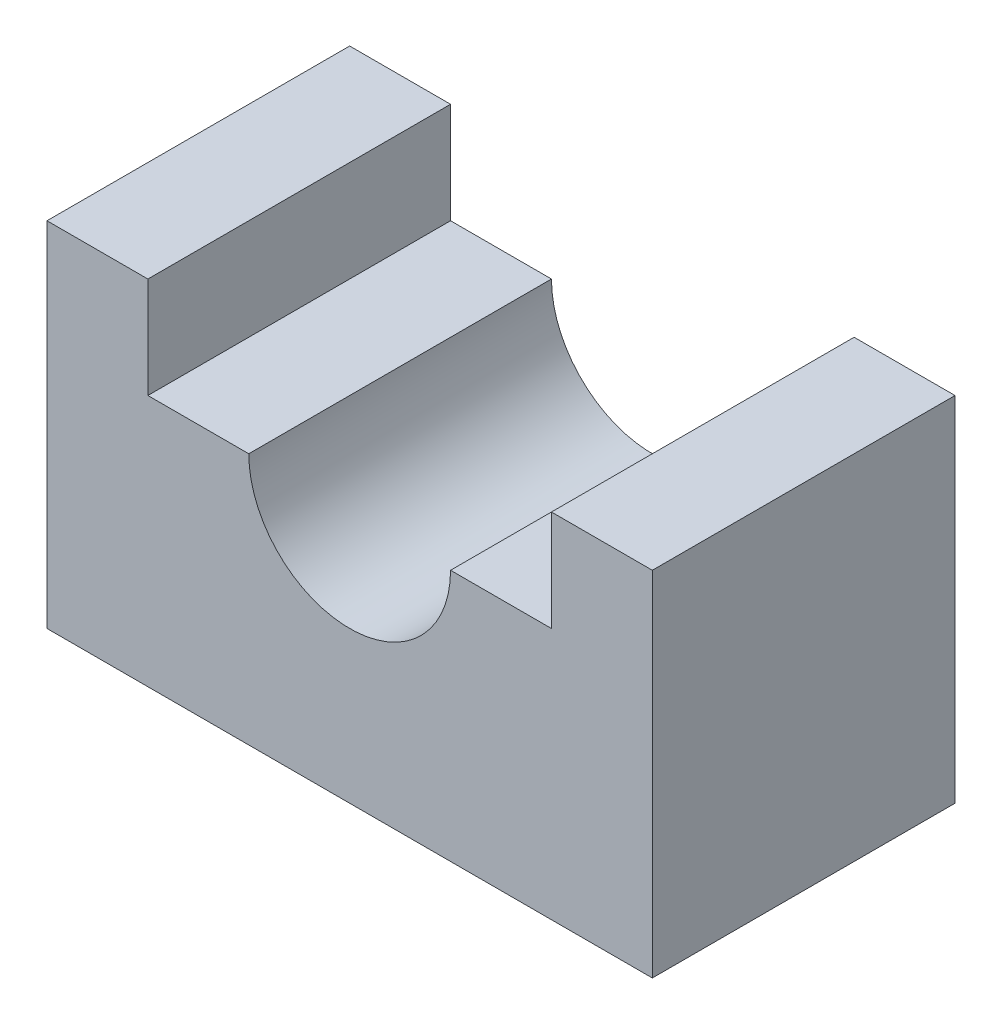
ISO-10303-21;
HEADER;
FILE_DESCRIPTION(('STEP AP214'),'2;1');
FILE_NAME('part.step','',(''),(''),'','','');
FILE_SCHEMA(('AUTOMOTIVE_DESIGN { 1 0 10303 214 1 1 1 1 }'));
ENDSEC;
DATA;
#1=APPLICATION_CONTEXT('core data for automotive mechanical design processes');
#2=APPLICATION_PROTOCOL_DEFINITION('international standard','automotive_design',2000,#1);
#3=PRODUCT_CONTEXT('',#1,'mechanical');
#4=PRODUCT('Part','Part','',(#3));
#5=PRODUCT_RELATED_PRODUCT_CATEGORY('part','',(#4));
#6=PRODUCT_DEFINITION_FORMATION('','',#4);
#7=PRODUCT_DEFINITION_CONTEXT('part definition',#1,'design');
#8=PRODUCT_DEFINITION('design','',#6,#7);
#9=PRODUCT_DEFINITION_SHAPE('','',#8);
#10=(LENGTH_UNIT() NAMED_UNIT(*) SI_UNIT(.MILLI.,.METRE.));
#11=(NAMED_UNIT(*) PLANE_ANGLE_UNIT() SI_UNIT($,.RADIAN.));
#12=(NAMED_UNIT(*) SI_UNIT($,.STERADIAN.) SOLID_ANGLE_UNIT());
#13=UNCERTAINTY_MEASURE_WITH_UNIT(LENGTH_MEASURE(1.E-05),#10,'distance_accuracy_value','');
#14=(GEOMETRIC_REPRESENTATION_CONTEXT(3) GLOBAL_UNCERTAINTY_ASSIGNED_CONTEXT((#13)) GLOBAL_UNIT_ASSIGNED_CONTEXT((#10,
#11,#12)) REPRESENTATION_CONTEXT('',''));
#15=CARTESIAN_POINT('',(0.,0.,0.));
#16=DIRECTION('',(0.,0.,1.));
#17=DIRECTION('',(1.,0.,0.));
#18=AXIS2_PLACEMENT_3D('',#15,#16,#17);
#19=CARTESIAN_POINT('',(30.,35.,15.));
#20=DIRECTION('',(-1.,0.,0.));
#21=DIRECTION('',(0.,-1.,0.));
#22=AXIS2_PLACEMENT_3D('',#19,#20,#21);
#23=PLANE('',#22);
#24=DIRECTION('',(0.,1.,0.));
#25=VECTOR('',#24,1.);
#26=CARTESIAN_POINT('',(30.,35.,-15.));
#27=LINE('',#26,#25);
#28=CARTESIAN_POINT('',(30.,0.,-15.));
#29=VERTEX_POINT('',#28);
#30=CARTESIAN_POINT('',(30.,35.,-15.));
#31=VERTEX_POINT('',#30);
#32=EDGE_CURVE('E150',#29,#31,#27,.T.);
#33=ORIENTED_EDGE('',*,*,#32,.T.);
#34=DIRECTION('',(0.,0.,-1.));
#35=VECTOR('',#34,1.);
#36=CARTESIAN_POINT('',(30.,35.,15.));
#37=LINE('',#36,#35);
#38=CARTESIAN_POINT('',(30.,35.,15.));
#39=VERTEX_POINT('',#38);
#40=EDGE_CURVE('E11',#39,#31,#37,.T.);
#41=ORIENTED_EDGE('',*,*,#40,.F.);
#42=DIRECTION('',(0.,1.,0.));
#43=VECTOR('',#42,1.);
#44=CARTESIAN_POINT('',(30.,35.,15.));
#45=LINE('',#44,#43);
#46=CARTESIAN_POINT('',(30.,0.,15.));
#47=VERTEX_POINT('',#46);
#48=EDGE_CURVE('E165',#47,#39,#45,.T.);
#49=ORIENTED_EDGE('',*,*,#48,.F.);
#50=DIRECTION('',(0.,0.,-1.));
#51=VECTOR('',#50,1.);
#52=CARTESIAN_POINT('',(30.,0.,15.));
#53=LINE('',#52,#51);
#54=EDGE_CURVE('E142',#47,#29,#53,.T.);
#55=ORIENTED_EDGE('',*,*,#54,.T.);
#56=EDGE_LOOP('',(#33,#41,#49,#55));
#57=FACE_BOUND('',#56,.T.);
#58=ADVANCED_FACE('F39',(#57),#23,.F.);
#59=CARTESIAN_POINT('',(20.,35.,15.));
#60=DIRECTION('',(0.,-1.,0.));
#61=DIRECTION('',(1.,0.,0.));
#62=AXIS2_PLACEMENT_3D('',#59,#60,#61);
#63=PLANE('',#62);
#64=DIRECTION('',(-1.,0.,0.));
#65=VECTOR('',#64,1.);
#66=CARTESIAN_POINT('',(20.,35.,-15.));
#67=LINE('',#66,#65);
#68=CARTESIAN_POINT('',(20.,35.,-15.));
#69=VERTEX_POINT('',#68);
#70=EDGE_CURVE('E148',#31,#69,#67,.T.);
#71=ORIENTED_EDGE('',*,*,#70,.T.);
#72=DIRECTION('',(0.,0.,-1.));
#73=VECTOR('',#72,1.);
#74=CARTESIAN_POINT('',(20.,35.,15.));
#75=LINE('',#74,#73);
#76=CARTESIAN_POINT('',(20.,35.,15.));
#77=VERTEX_POINT('',#76);
#78=EDGE_CURVE('E50',#77,#69,#75,.T.);
#79=ORIENTED_EDGE('',*,*,#78,.F.);
#80=DIRECTION('',(-1.,0.,0.));
#81=VECTOR('',#80,1.);
#82=CARTESIAN_POINT('',(20.,35.,15.));
#83=LINE('',#82,#81);
#84=EDGE_CURVE('E101',#39,#77,#83,.T.);
#85=ORIENTED_EDGE('',*,*,#84,.F.);
#86=ORIENTED_EDGE('',*,*,#40,.T.);
#87=EDGE_LOOP('',(#71,#79,#85,#86));
#88=FACE_BOUND('',#87,.T.);
#89=ADVANCED_FACE('F215',(#88),#63,.F.);
#90=CARTESIAN_POINT('',(20.,25.,15.));
#91=DIRECTION('',(1.,0.,0.));
#92=DIRECTION('',(0.,0.,-1.));
#93=AXIS2_PLACEMENT_3D('',#90,#91,#92);
#94=PLANE('',#93);
#95=DIRECTION('',(0.,-1.,0.));
#96=VECTOR('',#95,1.);
#97=CARTESIAN_POINT('',(20.,25.,-15.));
#98=LINE('',#97,#96);
#99=CARTESIAN_POINT('',(20.,25.,-15.));
#100=VERTEX_POINT('',#99);
#101=EDGE_CURVE('E152',#69,#100,#98,.T.);
#102=ORIENTED_EDGE('',*,*,#101,.T.);
#103=DIRECTION('',(0.,0.,-1.));
#104=VECTOR('',#103,1.);
#105=CARTESIAN_POINT('',(20.,25.,15.));
#106=LINE('',#105,#104);
#107=CARTESIAN_POINT('',(20.,25.,15.));
#108=VERTEX_POINT('',#107);
#109=EDGE_CURVE('E178',#108,#100,#106,.T.);
#110=ORIENTED_EDGE('',*,*,#109,.F.);
#111=DIRECTION('',(0.,-1.,0.));
#112=VECTOR('',#111,1.);
#113=CARTESIAN_POINT('',(20.,25.,15.));
#114=LINE('',#113,#112);
#115=EDGE_CURVE('E186',#77,#108,#114,.T.);
#116=ORIENTED_EDGE('',*,*,#115,.F.);
#117=ORIENTED_EDGE('',*,*,#78,.T.);
#118=EDGE_LOOP('',(#102,#110,#116,#117));
#119=FACE_BOUND('',#118,.T.);
#120=ADVANCED_FACE('F182',(#119),#94,.F.);
#121=CARTESIAN_POINT('',(9.99999999999987,25.,15.));
#122=DIRECTION('',(0.,-1.,0.));
#123=DIRECTION('',(0.,0.,-1.));
#124=AXIS2_PLACEMENT_3D('',#121,#122,#123);
#125=PLANE('',#124);
#126=DIRECTION('',(-1.,0.,0.));
#127=VECTOR('',#126,1.);
#128=CARTESIAN_POINT('',(9.99999999999987,25.,-15.));
#129=LINE('',#128,#127);
#130=CARTESIAN_POINT('',(10.,25.,-15.));
#131=VERTEX_POINT('',#130);
#132=EDGE_CURVE('E153',#100,#131,#129,.T.);
#133=ORIENTED_EDGE('',*,*,#132,.T.);
#134=DIRECTION('',(0.,0.,-1.));
#135=VECTOR('',#134,1.);
#136=CARTESIAN_POINT('',(10.,25.,15.));
#137=LINE('',#136,#135);
#138=CARTESIAN_POINT('',(10.,25.,15.));
#139=VERTEX_POINT('',#138);
#140=EDGE_CURVE('E172',#139,#131,#137,.T.);
#141=ORIENTED_EDGE('',*,*,#140,.F.);
#142=DIRECTION('',(-1.,0.,0.));
#143=VECTOR('',#142,1.);
#144=CARTESIAN_POINT('',(9.99999999999987,25.,15.));
#145=LINE('',#144,#143);
#146=EDGE_CURVE('E204',#108,#139,#145,.T.);
#147=ORIENTED_EDGE('',*,*,#146,.F.);
#148=ORIENTED_EDGE('',*,*,#109,.T.);
#149=EDGE_LOOP('',(#133,#141,#147,#148));
#150=FACE_BOUND('',#149,.T.);
#151=ADVANCED_FACE('F193',(#150),#125,.F.);
#152=CARTESIAN_POINT('',(1.28369537222284E-13,25.,15.));
#153=DIRECTION('',(0.,0.,-1.));
#154=DIRECTION('',(-1.,0.,0.));
#155=AXIS2_PLACEMENT_3D('',#152,#153,#154);
#156=CYLINDRICAL_SURFACE('',#155,9.99999999999987);
#157=CARTESIAN_POINT('',(1.28369537222284E-13,25.,-15.));
#158=DIRECTION('',(0.,0.,-1.));
#159=DIRECTION('',(1.,0.,0.));
#160=AXIS2_PLACEMENT_3D('',#157,#158,#159);
#161=CIRCLE('',#160,9.99999999999987);
#162=CARTESIAN_POINT('',(-9.99999999999987,25.,-15.));
#163=VERTEX_POINT('',#162);
#164=EDGE_CURVE('E157',#131,#163,#161,.T.);
#165=ORIENTED_EDGE('',*,*,#164,.T.);
#166=DIRECTION('',(0.,0.,-1.));
#167=VECTOR('',#166,1.);
#168=CARTESIAN_POINT('',(-9.99999999999987,25.,15.));
#169=LINE('',#168,#167);
#170=CARTESIAN_POINT('',(-9.99999999999987,25.,15.));
#171=VERTEX_POINT('',#170);
#172=EDGE_CURVE('E175',#171,#163,#169,.T.);
#173=ORIENTED_EDGE('',*,*,#172,.F.);
#174=CARTESIAN_POINT('',(1.28369537222284E-13,25.,15.));
#175=DIRECTION('',(0.,0.,-1.));
#176=DIRECTION('',(1.,0.,0.));
#177=AXIS2_PLACEMENT_3D('',#174,#175,#176);
#178=CIRCLE('',#177,9.99999999999987);
#179=EDGE_CURVE('E202',#139,#171,#178,.T.);
#180=ORIENTED_EDGE('',*,*,#179,.F.);
#181=ORIENTED_EDGE('',*,*,#140,.T.);
#182=EDGE_LOOP('',(#165,#173,#180,#181));
#183=FACE_BOUND('',#182,.T.);
#184=ADVANCED_FACE('F198',(#183),#156,.F.);
#185=CARTESIAN_POINT('',(-20.,25.,15.));
#186=DIRECTION('',(0.,-1.,0.));
#187=DIRECTION('',(0.,0.,-1.));
#188=AXIS2_PLACEMENT_3D('',#185,#186,#187);
#189=PLANE('',#188);
#190=DIRECTION('',(-1.,0.,0.));
#191=VECTOR('',#190,1.);
#192=CARTESIAN_POINT('',(-20.,25.,-15.));
#193=LINE('',#192,#191);
#194=CARTESIAN_POINT('',(-20.,25.,-15.));
#195=VERTEX_POINT('',#194);
#196=EDGE_CURVE('E156',#163,#195,#193,.T.);
#197=ORIENTED_EDGE('',*,*,#196,.T.);
#198=DIRECTION('',(0.,0.,-1.));
#199=VECTOR('',#198,1.);
#200=CARTESIAN_POINT('',(-20.,25.,15.));
#201=LINE('',#200,#199);
#202=CARTESIAN_POINT('',(-20.,25.,15.));
#203=VERTEX_POINT('',#202);
#204=EDGE_CURVE('E170',#203,#195,#201,.T.);
#205=ORIENTED_EDGE('',*,*,#204,.F.);
#206=DIRECTION('',(-1.,0.,0.));
#207=VECTOR('',#206,1.);
#208=CARTESIAN_POINT('',(-20.,25.,15.));
#209=LINE('',#208,#207);
#210=EDGE_CURVE('E201',#171,#203,#209,.T.);
#211=ORIENTED_EDGE('',*,*,#210,.F.);
#212=ORIENTED_EDGE('',*,*,#172,.T.);
#213=EDGE_LOOP('',(#197,#205,#211,#212));
#214=FACE_BOUND('',#213,.T.);
#215=ADVANCED_FACE('F226',(#214),#189,.F.);
#216=CARTESIAN_POINT('',(-20.,35.,15.));
#217=DIRECTION('',(-1.,0.,0.));
#218=DIRECTION('',(0.,0.,1.));
#219=AXIS2_PLACEMENT_3D('',#216,#217,#218);
#220=PLANE('',#219);
#221=DIRECTION('',(0.,1.,0.));
#222=VECTOR('',#221,1.);
#223=CARTESIAN_POINT('',(-20.,35.,-15.));
#224=LINE('',#223,#222);
#225=CARTESIAN_POINT('',(-20.,35.,-15.));
#226=VERTEX_POINT('',#225);
#227=EDGE_CURVE('E158',#195,#226,#224,.T.);
#228=ORIENTED_EDGE('',*,*,#227,.T.);
#229=DIRECTION('',(0.,0.,-1.));
#230=VECTOR('',#229,1.);
#231=CARTESIAN_POINT('',(-20.,35.,15.));
#232=LINE('',#231,#230);
#233=CARTESIAN_POINT('',(-20.,35.,15.));
#234=VERTEX_POINT('',#233);
#235=EDGE_CURVE('E138',#234,#226,#232,.T.);
#236=ORIENTED_EDGE('',*,*,#235,.F.);
#237=DIRECTION('',(0.,1.,0.));
#238=VECTOR('',#237,1.);
#239=CARTESIAN_POINT('',(-20.,35.,15.));
#240=LINE('',#239,#238);
#241=EDGE_CURVE('E129',#203,#234,#240,.T.);
#242=ORIENTED_EDGE('',*,*,#241,.F.);
#243=ORIENTED_EDGE('',*,*,#204,.T.);
#244=EDGE_LOOP('',(#228,#236,#242,#243));
#245=FACE_BOUND('',#244,.T.);
#246=ADVANCED_FACE('F227',(#245),#220,.F.);
#247=CARTESIAN_POINT('',(-30.,35.,15.));
#248=DIRECTION('',(0.,-1.,0.));
#249=DIRECTION('',(0.,0.,-1.));
#250=AXIS2_PLACEMENT_3D('',#247,#248,#249);
#251=PLANE('',#250);
#252=DIRECTION('',(-1.,0.,0.));
#253=VECTOR('',#252,1.);
#254=CARTESIAN_POINT('',(-30.,35.,-15.));
#255=LINE('',#254,#253);
#256=CARTESIAN_POINT('',(-30.,35.,-15.));
#257=VERTEX_POINT('',#256);
#258=EDGE_CURVE('E140',#226,#257,#255,.T.);
#259=ORIENTED_EDGE('',*,*,#258,.T.);
#260=DIRECTION('',(0.,0.,-1.));
#261=VECTOR('',#260,1.);
#262=CARTESIAN_POINT('',(-30.,35.,15.));
#263=LINE('',#262,#261);
#264=CARTESIAN_POINT('',(-30.,35.,15.));
#265=VERTEX_POINT('',#264);
#266=EDGE_CURVE('E132',#265,#257,#263,.T.);
#267=ORIENTED_EDGE('',*,*,#266,.F.);
#268=DIRECTION('',(-1.,0.,0.));
#269=VECTOR('',#268,1.);
#270=CARTESIAN_POINT('',(-30.,35.,15.));
#271=LINE('',#270,#269);
#272=EDGE_CURVE('E121',#234,#265,#271,.T.);
#273=ORIENTED_EDGE('',*,*,#272,.F.);
#274=ORIENTED_EDGE('',*,*,#235,.T.);
#275=EDGE_LOOP('',(#259,#267,#273,#274));
#276=FACE_BOUND('',#275,.T.);
#277=ADVANCED_FACE('F134',(#276),#251,.F.);
#278=CARTESIAN_POINT('',(-30.,35.,15.));
#279=DIRECTION('',(1.,0.,0.));
#280=DIRECTION('',(0.,1.,0.));
#281=AXIS2_PLACEMENT_3D('',#278,#279,#280);
#282=PLANE('',#281);
#283=DIRECTION('',(0.,-1.,0.));
#284=VECTOR('',#283,1.);
#285=CARTESIAN_POINT('',(-30.,35.,-15.));
#286=LINE('',#285,#284);
#287=CARTESIAN_POINT('',(-30.,0.,-15.));
#288=VERTEX_POINT('',#287);
#289=EDGE_CURVE('E89',#257,#288,#286,.T.);
#290=ORIENTED_EDGE('',*,*,#289,.T.);
#291=DIRECTION('',(0.,0.,-1.));
#292=VECTOR('',#291,1.);
#293=CARTESIAN_POINT('',(-30.,0.,15.));
#294=LINE('',#293,#292);
#295=CARTESIAN_POINT('',(-30.,0.,15.));
#296=VERTEX_POINT('',#295);
#297=EDGE_CURVE('E137',#296,#288,#294,.T.);
#298=ORIENTED_EDGE('',*,*,#297,.F.);
#299=DIRECTION('',(0.,-1.,0.));
#300=VECTOR('',#299,1.);
#301=CARTESIAN_POINT('',(-30.,35.,15.));
#302=LINE('',#301,#300);
#303=EDGE_CURVE('E130',#265,#296,#302,.T.);
#304=ORIENTED_EDGE('',*,*,#303,.F.);
#305=ORIENTED_EDGE('',*,*,#266,.T.);
#306=EDGE_LOOP('',(#290,#298,#304,#305));
#307=FACE_BOUND('',#306,.T.);
#308=ADVANCED_FACE('F141',(#307),#282,.F.);
#309=CARTESIAN_POINT('',(-30.,0.,15.));
#310=DIRECTION('',(0.,1.,0.));
#311=DIRECTION('',(0.,0.,1.));
#312=AXIS2_PLACEMENT_3D('',#309,#310,#311);
#313=PLANE('',#312);
#314=DIRECTION('',(1.,0.,0.));
#315=VECTOR('',#314,1.);
#316=CARTESIAN_POINT('',(-30.,0.,-15.));
#317=LINE('',#316,#315);
#318=EDGE_CURVE('E96',#288,#29,#317,.T.);
#319=ORIENTED_EDGE('',*,*,#318,.T.);
#320=ORIENTED_EDGE('',*,*,#54,.F.);
#321=DIRECTION('',(1.,0.,0.));
#322=VECTOR('',#321,1.);
#323=CARTESIAN_POINT('',(-30.,0.,15.));
#324=LINE('',#323,#322);
#325=EDGE_CURVE('E54',#296,#47,#324,.T.);
#326=ORIENTED_EDGE('',*,*,#325,.F.);
#327=ORIENTED_EDGE('',*,*,#297,.T.);
#328=EDGE_LOOP('',(#319,#320,#326,#327));
#329=FACE_BOUND('',#328,.T.);
#330=ADVANCED_FACE('F239',(#329),#313,.F.);
#331=CARTESIAN_POINT('',(1.28369537222284E-13,25.,15.));
#332=DIRECTION('',(0.,0.,1.));
#333=DIRECTION('',(1.,0.,0.));
#334=AXIS2_PLACEMENT_3D('',#331,#332,#333);
#335=PLANE('',#334);
#336=ORIENTED_EDGE('',*,*,#48,.T.);
#337=ORIENTED_EDGE('',*,*,#84,.T.);
#338=ORIENTED_EDGE('',*,*,#115,.T.);
#339=ORIENTED_EDGE('',*,*,#146,.T.);
#340=ORIENTED_EDGE('',*,*,#179,.T.);
#341=ORIENTED_EDGE('',*,*,#210,.T.);
#342=ORIENTED_EDGE('',*,*,#241,.T.);
#343=ORIENTED_EDGE('',*,*,#272,.T.);
#344=ORIENTED_EDGE('',*,*,#303,.T.);
#345=ORIENTED_EDGE('',*,*,#325,.T.);
#346=EDGE_LOOP('',(#336,#337,#338,#339,#340,#341,#342,#343,#344,#345));
#347=FACE_BOUND('',#346,.T.);
#348=ADVANCED_FACE('F124',(#347),#335,.T.);
#349=CARTESIAN_POINT('',(1.28369537222284E-13,25.,-15.));
#350=DIRECTION('',(0.,0.,1.));
#351=DIRECTION('',(1.,0.,0.));
#352=AXIS2_PLACEMENT_3D('',#349,#350,#351);
#353=PLANE('',#352);
#354=ORIENTED_EDGE('',*,*,#32,.F.);
#355=ORIENTED_EDGE('',*,*,#318,.F.);
#356=ORIENTED_EDGE('',*,*,#289,.F.);
#357=ORIENTED_EDGE('',*,*,#258,.F.);
#358=ORIENTED_EDGE('',*,*,#227,.F.);
#359=ORIENTED_EDGE('',*,*,#196,.F.);
#360=ORIENTED_EDGE('',*,*,#164,.F.);
#361=ORIENTED_EDGE('',*,*,#132,.F.);
#362=ORIENTED_EDGE('',*,*,#101,.F.);
#363=ORIENTED_EDGE('',*,*,#70,.F.);
#364=EDGE_LOOP('',(#354,#355,#356,#357,#358,#359,#360,#361,#362,#363));
#365=FACE_BOUND('',#364,.T.);
#366=ADVANCED_FACE('F189',(#365),#353,.F.);
#367=CLOSED_SHELL('',(#58,#89,#120,#151,#184,#215,#246,#277,#308,#330,#348,#366));
#368=MANIFOLD_SOLID_BREP('B2',#367);
#369=ADVANCED_BREP_SHAPE_REPRESENTATION('',(#18,#368),#14);
#370=SHAPE_DEFINITION_REPRESENTATION(#9,#369);
ENDSEC;
END-ISO-10303-21;
